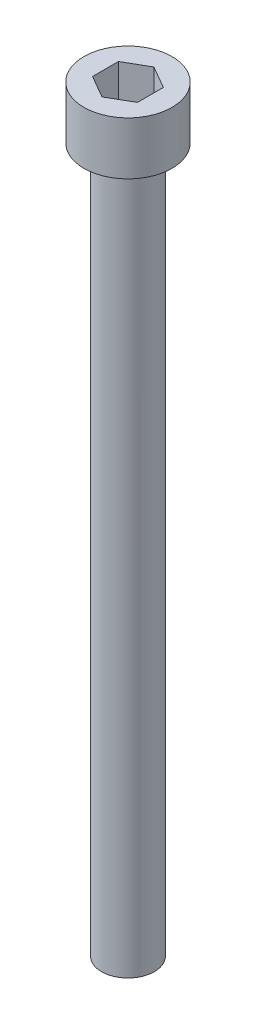
ISO-10303-21;
HEADER;
FILE_DESCRIPTION(('STEP AP214'),'2;1');
FILE_NAME('part.step','',(''),(''),'','','');
FILE_SCHEMA(('AUTOMOTIVE_DESIGN { 1 0 10303 214 1 1 1 1 }'));
ENDSEC;
DATA;
#1=APPLICATION_CONTEXT('core data for automotive mechanical design processes');
#2=APPLICATION_PROTOCOL_DEFINITION('international standard','automotive_design',2000,#1);
#3=PRODUCT_CONTEXT('',#1,'mechanical');
#4=PRODUCT('Part','Part','',(#3));
#5=PRODUCT_RELATED_PRODUCT_CATEGORY('part','',(#4));
#6=PRODUCT_DEFINITION_FORMATION('','',#4);
#7=PRODUCT_DEFINITION_CONTEXT('part definition',#1,'design');
#8=PRODUCT_DEFINITION('design','',#6,#7);
#9=PRODUCT_DEFINITION_SHAPE('','',#8);
#10=(LENGTH_UNIT() NAMED_UNIT(*) SI_UNIT(.MILLI.,.METRE.));
#11=(NAMED_UNIT(*) PLANE_ANGLE_UNIT() SI_UNIT($,.RADIAN.));
#12=(NAMED_UNIT(*) SI_UNIT($,.STERADIAN.) SOLID_ANGLE_UNIT());
#13=UNCERTAINTY_MEASURE_WITH_UNIT(LENGTH_MEASURE(1.E-05),#10,'distance_accuracy_value','');
#14=(GEOMETRIC_REPRESENTATION_CONTEXT(3) GLOBAL_UNCERTAINTY_ASSIGNED_CONTEXT((#13)) GLOBAL_UNIT_ASSIGNED_CONTEXT((#10,
#11,#12)) REPRESENTATION_CONTEXT('',''));
#15=CARTESIAN_POINT('',(0.,0.,0.));
#16=DIRECTION('',(0.,0.,1.));
#17=DIRECTION('',(1.,0.,0.));
#18=AXIS2_PLACEMENT_3D('',#15,#16,#17);
#19=CARTESIAN_POINT('',(0.,0.,0.));
#20=DIRECTION('',(0.,1.,0.));
#21=DIRECTION('',(0.,0.,1.));
#22=AXIS2_PLACEMENT_3D('',#19,#20,#21);
#23=PLANE('',#22);
#24=CARTESIAN_POINT('',(0.,0.,0.));
#25=DIRECTION('',(0.,1.,0.));
#26=DIRECTION('',(0.,0.,1.));
#27=AXIS2_PLACEMENT_3D('',#24,#25,#26);
#28=CIRCLE('',#27,5.);
#29=CARTESIAN_POINT('',(0.,0.,5.));
#30=VERTEX_POINT('',#29);
#31=EDGE_CURVE('E142',#30,#30,#28,.T.);
#32=ORIENTED_EDGE('',*,*,#31,.F.);
#33=EDGE_LOOP('',(#32));
#34=FACE_BOUND('',#33,.T.);
#35=CARTESIAN_POINT('',(0.,0.,0.));
#36=DIRECTION('',(0.,1.,0.));
#37=DIRECTION('',(0.,0.,1.));
#38=AXIS2_PLACEMENT_3D('',#35,#36,#37);
#39=CIRCLE('',#38,3.);
#40=CARTESIAN_POINT('',(0.,0.,3.));
#41=VERTEX_POINT('',#40);
#42=EDGE_CURVE('E11',#41,#41,#39,.F.);
#43=ORIENTED_EDGE('',*,*,#42,.F.);
#44=EDGE_LOOP('',(#43));
#45=FACE_BOUND('',#44,.T.);
#46=ADVANCED_FACE('F31',(#34,#45),#23,.F.);
#47=CARTESIAN_POINT('',(0.,6.,0.));
#48=DIRECTION('',(0.,1.,0.));
#49=DIRECTION('',(0.,0.,1.));
#50=AXIS2_PLACEMENT_3D('',#47,#48,#49);
#51=PLANE('',#50);
#52=CARTESIAN_POINT('',(0.,6.,0.));
#53=DIRECTION('',(0.,1.,0.));
#54=DIRECTION('',(0.,0.,1.));
#55=AXIS2_PLACEMENT_3D('',#52,#53,#54);
#56=CIRCLE('',#55,5.);
#57=CARTESIAN_POINT('',(0.,6.,5.));
#58=VERTEX_POINT('',#57);
#59=EDGE_CURVE('E39',#58,#58,#56,.T.);
#60=ORIENTED_EDGE('',*,*,#59,.T.);
#61=EDGE_LOOP('',(#60));
#62=FACE_BOUND('',#61,.T.);
#63=DIRECTION('',(0.866025403784439,0.,-0.5));
#64=VECTOR('',#63,1.);
#65=CARTESIAN_POINT('',(0.,6.,2.94448637286712));
#66=LINE('',#65,#64);
#67=CARTESIAN_POINT('',(0.,6.,2.94448637286712));
#68=VERTEX_POINT('',#67);
#69=CARTESIAN_POINT('',(2.55000000000002,6.,1.47224318643356));
#70=VERTEX_POINT('',#69);
#71=EDGE_CURVE('E101',#68,#70,#66,.T.);
#72=ORIENTED_EDGE('',*,*,#71,.F.);
#73=DIRECTION('',(0.866025403784439,0.,0.5));
#74=VECTOR('',#73,1.);
#75=CARTESIAN_POINT('',(-2.55000000000002,6.,1.47224318643356));
#76=LINE('',#75,#74);
#77=CARTESIAN_POINT('',(-2.55000000000002,6.,1.47224318643356));
#78=VERTEX_POINT('',#77);
#79=EDGE_CURVE('E81',#78,#68,#76,.T.);
#80=ORIENTED_EDGE('',*,*,#79,.F.);
#81=DIRECTION('',(0.,0.,1.));
#82=VECTOR('',#81,1.);
#83=CARTESIAN_POINT('',(-2.55000000000002,6.,-1.47224318643356));
#84=LINE('',#83,#82);
#85=CARTESIAN_POINT('',(-2.55000000000002,6.,-1.47224318643356));
#86=VERTEX_POINT('',#85);
#87=EDGE_CURVE('E52',#86,#78,#84,.T.);
#88=ORIENTED_EDGE('',*,*,#87,.F.);
#89=DIRECTION('',(-0.866025403784439,0.,0.5));
#90=VECTOR('',#89,1.);
#91=CARTESIAN_POINT('',(0.,6.,-2.94448637286712));
#92=LINE('',#91,#90);
#93=CARTESIAN_POINT('',(0.,6.,-2.94448637286712));
#94=VERTEX_POINT('',#93);
#95=EDGE_CURVE('E113',#94,#86,#92,.T.);
#96=ORIENTED_EDGE('',*,*,#95,.F.);
#97=DIRECTION('',(-0.866025403784439,0.,-0.5));
#98=VECTOR('',#97,1.);
#99=CARTESIAN_POINT('',(2.55000000000002,6.,-1.47224318643356));
#100=LINE('',#99,#98);
#101=CARTESIAN_POINT('',(2.55000000000002,6.,-1.47224318643356));
#102=VERTEX_POINT('',#101);
#103=EDGE_CURVE('E100',#102,#94,#100,.T.);
#104=ORIENTED_EDGE('',*,*,#103,.F.);
#105=DIRECTION('',(0.,0.,-1.));
#106=VECTOR('',#105,1.);
#107=CARTESIAN_POINT('',(2.55000000000002,6.,1.47224318643356));
#108=LINE('',#107,#106);
#109=EDGE_CURVE('E90',#70,#102,#108,.T.);
#110=ORIENTED_EDGE('',*,*,#109,.F.);
#111=EDGE_LOOP('',(#72,#80,#88,#96,#104,#110));
#112=FACE_BOUND('',#111,.T.);
#113=ADVANCED_FACE('F112',(#62,#112),#51,.T.);
#114=CARTESIAN_POINT('',(0.,6.,0.));
#115=DIRECTION('',(0.,-1.,0.));
#116=DIRECTION('',(0.,0.,-1.));
#117=AXIS2_PLACEMENT_3D('',#114,#115,#116);
#118=CYLINDRICAL_SURFACE('',#117,5.);
#119=ORIENTED_EDGE('',*,*,#59,.F.);
#120=EDGE_LOOP('',(#119));
#121=FACE_BOUND('',#120,.T.);
#122=ORIENTED_EDGE('',*,*,#31,.T.);
#123=EDGE_LOOP('',(#122));
#124=FACE_BOUND('',#123,.T.);
#125=ADVANCED_FACE('F33',(#121,#124),#118,.T.);
#126=CARTESIAN_POINT('',(-2.55000000000002,6.,1.47224318643356));
#127=DIRECTION('',(0.5,0.,-0.866025403784438));
#128=DIRECTION('',(-0.866025403784439,0.,-0.5));
#129=AXIS2_PLACEMENT_3D('',#126,#127,#128);
#130=PLANE('',#129);
#131=DIRECTION('',(0.866025403784439,0.,0.5));
#132=VECTOR('',#131,1.);
#133=CARTESIAN_POINT('',(-2.55000000000002,0.,1.47224318643356));
#134=LINE('',#133,#132);
#135=CARTESIAN_POINT('',(-2.55000000000002,0.,1.47224318643356));
#136=VERTEX_POINT('',#135);
#137=CARTESIAN_POINT('',(0.,0.,2.94448637286712));
#138=VERTEX_POINT('',#137);
#139=EDGE_CURVE('E120',#136,#138,#134,.T.);
#140=ORIENTED_EDGE('',*,*,#139,.F.);
#141=DIRECTION('',(0.,-1.,0.));
#142=VECTOR('',#141,1.);
#143=CARTESIAN_POINT('',(-2.55000000000002,6.,1.47224318643356));
#144=LINE('',#143,#142);
#145=EDGE_CURVE('E119',#78,#136,#144,.T.);
#146=ORIENTED_EDGE('',*,*,#145,.F.);
#147=ORIENTED_EDGE('',*,*,#79,.T.);
#148=DIRECTION('',(0.,-1.,0.));
#149=VECTOR('',#148,1.);
#150=CARTESIAN_POINT('',(0.,6.,2.94448637286712));
#151=LINE('',#150,#149);
#152=EDGE_CURVE('E140',#68,#138,#151,.T.);
#153=ORIENTED_EDGE('',*,*,#152,.T.);
#154=EDGE_LOOP('',(#140,#146,#147,#153));
#155=FACE_BOUND('',#154,.T.);
#156=ADVANCED_FACE('F181',(#155),#130,.T.);
#157=CARTESIAN_POINT('',(0.,6.,2.94448637286712));
#158=DIRECTION('',(-0.5,0.,-0.866025403784438));
#159=DIRECTION('',(-0.866025403784439,0.,0.5));
#160=AXIS2_PLACEMENT_3D('',#157,#158,#159);
#161=PLANE('',#160);
#162=DIRECTION('',(0.866025403784439,0.,-0.5));
#163=VECTOR('',#162,1.);
#164=CARTESIAN_POINT('',(0.,0.,2.94448637286712));
#165=LINE('',#164,#163);
#166=CARTESIAN_POINT('',(2.55000000000002,0.,1.47224318643356));
#167=VERTEX_POINT('',#166);
#168=EDGE_CURVE('E123',#138,#167,#165,.T.);
#169=ORIENTED_EDGE('',*,*,#168,.F.);
#170=ORIENTED_EDGE('',*,*,#152,.F.);
#171=ORIENTED_EDGE('',*,*,#71,.T.);
#172=DIRECTION('',(0.,-1.,0.));
#173=VECTOR('',#172,1.);
#174=CARTESIAN_POINT('',(2.55000000000002,6.,1.47224318643356));
#175=LINE('',#174,#173);
#176=EDGE_CURVE('E96',#70,#167,#175,.T.);
#177=ORIENTED_EDGE('',*,*,#176,.T.);
#178=EDGE_LOOP('',(#169,#170,#171,#177));
#179=FACE_BOUND('',#178,.T.);
#180=ADVANCED_FACE('F178',(#179),#161,.T.);
#181=CARTESIAN_POINT('',(2.55000000000002,6.,1.47224318643356));
#182=DIRECTION('',(-1.,0.,0.));
#183=DIRECTION('',(0.,0.,1.));
#184=AXIS2_PLACEMENT_3D('',#181,#182,#183);
#185=PLANE('',#184);
#186=DIRECTION('',(0.,0.,-1.));
#187=VECTOR('',#186,1.);
#188=CARTESIAN_POINT('',(2.55000000000002,0.,1.47224318643356));
#189=LINE('',#188,#187);
#190=CARTESIAN_POINT('',(2.55000000000002,0.,-1.47224318643356));
#191=VERTEX_POINT('',#190);
#192=EDGE_CURVE('E127',#167,#191,#189,.T.);
#193=ORIENTED_EDGE('',*,*,#192,.F.);
#194=ORIENTED_EDGE('',*,*,#176,.F.);
#195=ORIENTED_EDGE('',*,*,#109,.T.);
#196=DIRECTION('',(0.,-1.,0.));
#197=VECTOR('',#196,1.);
#198=CARTESIAN_POINT('',(2.55000000000002,6.,-1.47224318643356));
#199=LINE('',#198,#197);
#200=EDGE_CURVE('E94',#102,#191,#199,.T.);
#201=ORIENTED_EDGE('',*,*,#200,.T.);
#202=EDGE_LOOP('',(#193,#194,#195,#201));
#203=FACE_BOUND('',#202,.T.);
#204=ADVANCED_FACE('F93',(#203),#185,.T.);
#205=CARTESIAN_POINT('',(2.55000000000002,6.,-1.47224318643356));
#206=DIRECTION('',(-0.5,0.,0.866025403784439));
#207=DIRECTION('',(0.866025403784439,0.,0.5));
#208=AXIS2_PLACEMENT_3D('',#205,#206,#207);
#209=PLANE('',#208);
#210=DIRECTION('',(-0.866025403784439,0.,-0.5));
#211=VECTOR('',#210,1.);
#212=CARTESIAN_POINT('',(2.55000000000002,0.,-1.47224318643356));
#213=LINE('',#212,#211);
#214=CARTESIAN_POINT('',(0.,0.,-2.94448637286712));
#215=VERTEX_POINT('',#214);
#216=EDGE_CURVE('E107',#191,#215,#213,.T.);
#217=ORIENTED_EDGE('',*,*,#216,.F.);
#218=ORIENTED_EDGE('',*,*,#200,.F.);
#219=ORIENTED_EDGE('',*,*,#103,.T.);
#220=DIRECTION('',(0.,-1.,0.));
#221=VECTOR('',#220,1.);
#222=CARTESIAN_POINT('',(0.,6.,-2.94448637286712));
#223=LINE('',#222,#221);
#224=EDGE_CURVE('E109',#94,#215,#223,.T.);
#225=ORIENTED_EDGE('',*,*,#224,.T.);
#226=EDGE_LOOP('',(#217,#218,#219,#225));
#227=FACE_BOUND('',#226,.T.);
#228=ADVANCED_FACE('F104',(#227),#209,.T.);
#229=CARTESIAN_POINT('',(0.,6.,-2.94448637286712));
#230=DIRECTION('',(0.5,0.,0.866025403784438));
#231=DIRECTION('',(0.866025403784439,0.,-0.5));
#232=AXIS2_PLACEMENT_3D('',#229,#230,#231);
#233=PLANE('',#232);
#234=DIRECTION('',(-0.866025403784439,0.,0.5));
#235=VECTOR('',#234,1.);
#236=CARTESIAN_POINT('',(0.,0.,-2.94448637286712));
#237=LINE('',#236,#235);
#238=CARTESIAN_POINT('',(-2.55000000000002,0.,-1.47224318643356));
#239=VERTEX_POINT('',#238);
#240=EDGE_CURVE('E130',#215,#239,#237,.T.);
#241=ORIENTED_EDGE('',*,*,#240,.F.);
#242=ORIENTED_EDGE('',*,*,#224,.F.);
#243=ORIENTED_EDGE('',*,*,#95,.T.);
#244=DIRECTION('',(0.,-1.,0.));
#245=VECTOR('',#244,1.);
#246=CARTESIAN_POINT('',(-2.55000000000002,6.,-1.47224318643356));
#247=LINE('',#246,#245);
#248=EDGE_CURVE('E46',#86,#239,#247,.T.);
#249=ORIENTED_EDGE('',*,*,#248,.T.);
#250=EDGE_LOOP('',(#241,#242,#243,#249));
#251=FACE_BOUND('',#250,.T.);
#252=ADVANCED_FACE('F171',(#251),#233,.T.);
#253=CARTESIAN_POINT('',(-2.55000000000002,6.,-1.47224318643356));
#254=DIRECTION('',(1.,0.,0.));
#255=DIRECTION('',(0.,0.,-1.));
#256=AXIS2_PLACEMENT_3D('',#253,#254,#255);
#257=PLANE('',#256);
#258=DIRECTION('',(0.,0.,1.));
#259=VECTOR('',#258,1.);
#260=CARTESIAN_POINT('',(-2.55000000000002,0.,-1.47224318643356));
#261=LINE('',#260,#259);
#262=EDGE_CURVE('E133',#239,#136,#261,.T.);
#263=ORIENTED_EDGE('',*,*,#262,.F.);
#264=ORIENTED_EDGE('',*,*,#248,.F.);
#265=ORIENTED_EDGE('',*,*,#87,.T.);
#266=ORIENTED_EDGE('',*,*,#145,.T.);
#267=EDGE_LOOP('',(#263,#264,#265,#266));
#268=FACE_BOUND('',#267,.T.);
#269=ADVANCED_FACE('F164',(#268),#257,.T.);
#270=CARTESIAN_POINT('',(0.,0.,0.));
#271=DIRECTION('',(0.,-1.,0.));
#272=DIRECTION('',(0.,0.,-1.));
#273=AXIS2_PLACEMENT_3D('',#270,#271,#272);
#274=PLANE('',#273);
#275=ORIENTED_EDGE('',*,*,#139,.T.);
#276=ORIENTED_EDGE('',*,*,#168,.T.);
#277=ORIENTED_EDGE('',*,*,#192,.T.);
#278=ORIENTED_EDGE('',*,*,#216,.T.);
#279=ORIENTED_EDGE('',*,*,#240,.T.);
#280=ORIENTED_EDGE('',*,*,#262,.T.);
#281=EDGE_LOOP('',(#275,#276,#277,#278,#279,#280));
#282=FACE_BOUND('',#281,.T.);
#283=ADVANCED_FACE('F155',(#282),#274,.F.);
#284=CARTESIAN_POINT('',(0.,-80.,0.));
#285=DIRECTION('',(0.,1.,0.));
#286=DIRECTION('',(0.,0.,1.));
#287=AXIS2_PLACEMENT_3D('',#284,#285,#286);
#288=CYLINDRICAL_SURFACE('',#287,3.);
#289=CARTESIAN_POINT('',(0.,-80.,0.));
#290=DIRECTION('',(0.,-1.,0.));
#291=DIRECTION('',(0.,0.,-1.));
#292=AXIS2_PLACEMENT_3D('',#289,#290,#291);
#293=CIRCLE('',#292,3.);
#294=CARTESIAN_POINT('',(0.,-80.,-3.));
#295=VERTEX_POINT('',#294);
#296=EDGE_CURVE('E124',#295,#295,#293,.T.);
#297=ORIENTED_EDGE('',*,*,#296,.F.);
#298=EDGE_LOOP('',(#297));
#299=FACE_BOUND('',#298,.T.);
#300=ORIENTED_EDGE('',*,*,#42,.T.);
#301=EDGE_LOOP('',(#300));
#302=FACE_BOUND('',#301,.T.);
#303=ADVANCED_FACE('F152',(#299,#302),#288,.T.);
#304=CARTESIAN_POINT('',(0.,-80.,0.));
#305=DIRECTION('',(0.,-1.,0.));
#306=DIRECTION('',(0.,0.,-1.));
#307=AXIS2_PLACEMENT_3D('',#304,#305,#306);
#308=PLANE('',#307);
#309=ORIENTED_EDGE('',*,*,#296,.T.);
#310=EDGE_LOOP('',(#309));
#311=FACE_BOUND('',#310,.T.);
#312=ADVANCED_FACE('F154',(#311),#308,.T.);
#313=CLOSED_SHELL('',(#46,#113,#125,#156,#180,#204,#228,#252,#269,#283,#303,#312));
#314=MANIFOLD_SOLID_BREP('B2',#313);
#315=ADVANCED_BREP_SHAPE_REPRESENTATION('',(#18,#314),#14);
#316=SHAPE_DEFINITION_REPRESENTATION(#9,#315);
ENDSEC;
END-ISO-10303-21;
